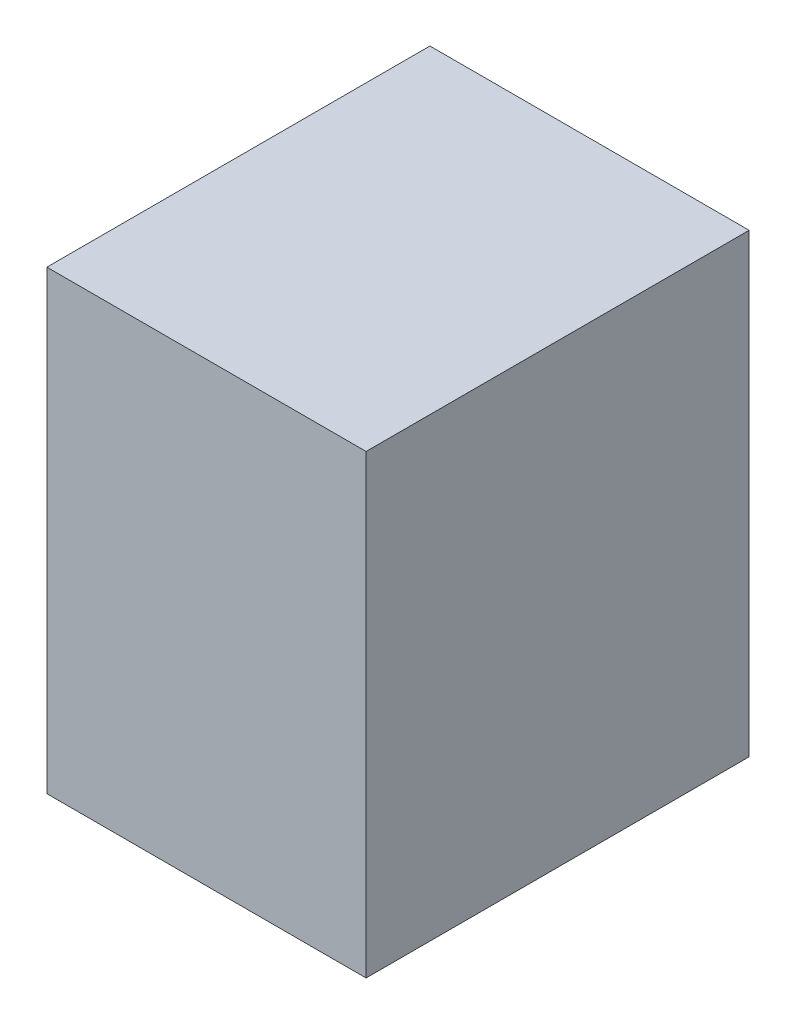
ISO-10303-21;
HEADER;
FILE_DESCRIPTION(('STEP AP214'),'2;1');
FILE_NAME('part.step','',(''),(''),'','','');
FILE_SCHEMA(('AUTOMOTIVE_DESIGN { 1 0 10303 214 1 1 1 1 }'));
ENDSEC;
DATA;
#1=APPLICATION_CONTEXT('core data for automotive mechanical design processes');
#2=APPLICATION_PROTOCOL_DEFINITION('international standard','automotive_design',2000,#1);
#3=PRODUCT_CONTEXT('',#1,'mechanical');
#4=PRODUCT('Part','Part','',(#3));
#5=PRODUCT_RELATED_PRODUCT_CATEGORY('part','',(#4));
#6=PRODUCT_DEFINITION_FORMATION('','',#4);
#7=PRODUCT_DEFINITION_CONTEXT('part definition',#1,'design');
#8=PRODUCT_DEFINITION('design','',#6,#7);
#9=PRODUCT_DEFINITION_SHAPE('','',#8);
#10=(LENGTH_UNIT() NAMED_UNIT(*) SI_UNIT(.MILLI.,.METRE.));
#11=(NAMED_UNIT(*) PLANE_ANGLE_UNIT() SI_UNIT($,.RADIAN.));
#12=(NAMED_UNIT(*) SI_UNIT($,.STERADIAN.) SOLID_ANGLE_UNIT());
#13=UNCERTAINTY_MEASURE_WITH_UNIT(LENGTH_MEASURE(1.E-05),#10,'distance_accuracy_value','');
#14=(GEOMETRIC_REPRESENTATION_CONTEXT(3) GLOBAL_UNCERTAINTY_ASSIGNED_CONTEXT((#13)) GLOBAL_UNIT_ASSIGNED_CONTEXT((#10,
#11,#12)) REPRESENTATION_CONTEXT('',''));
#15=CARTESIAN_POINT('',(0.,0.,0.));
#16=DIRECTION('',(0.,0.,1.));
#17=DIRECTION('',(1.,0.,0.));
#18=AXIS2_PLACEMENT_3D('',#15,#16,#17);
#19=CARTESIAN_POINT('',(8.75,25.,10.5));
#20=DIRECTION('',(-1.,0.,0.));
#21=DIRECTION('',(0.,0.,1.));
#22=AXIS2_PLACEMENT_3D('',#19,#20,#21);
#23=PLANE('',#22);
#24=DIRECTION('',(0.,0.,-1.));
#25=VECTOR('',#24,1.);
#26=CARTESIAN_POINT('',(8.75,0.,10.5));
#27=LINE('',#26,#25);
#28=CARTESIAN_POINT('',(8.75,0.,10.5));
#29=VERTEX_POINT('',#28);
#30=CARTESIAN_POINT('',(8.75,0.,-10.5));
#31=VERTEX_POINT('',#30);
#32=EDGE_CURVE('E98',#29,#31,#27,.T.);
#33=ORIENTED_EDGE('',*,*,#32,.T.);
#34=DIRECTION('',(0.,-1.,0.));
#35=VECTOR('',#34,1.);
#36=CARTESIAN_POINT('',(8.75,25.,-10.5));
#37=LINE('',#36,#35);
#38=CARTESIAN_POINT('',(8.75,25.,-10.5));
#39=VERTEX_POINT('',#38);
#40=EDGE_CURVE('E11',#39,#31,#37,.T.);
#41=ORIENTED_EDGE('',*,*,#40,.F.);
#42=DIRECTION('',(0.,0.,-1.));
#43=VECTOR('',#42,1.);
#44=CARTESIAN_POINT('',(8.75,25.,10.5));
#45=LINE('',#44,#43);
#46=CARTESIAN_POINT('',(8.75,25.,10.5));
#47=VERTEX_POINT('',#46);
#48=EDGE_CURVE('E86',#47,#39,#45,.T.);
#49=ORIENTED_EDGE('',*,*,#48,.F.);
#50=DIRECTION('',(0.,-1.,0.));
#51=VECTOR('',#50,1.);
#52=CARTESIAN_POINT('',(8.75,25.,10.5));
#53=LINE('',#52,#51);
#54=EDGE_CURVE('E94',#47,#29,#53,.T.);
#55=ORIENTED_EDGE('',*,*,#54,.T.);
#56=EDGE_LOOP('',(#33,#41,#49,#55));
#57=FACE_BOUND('',#56,.T.);
#58=ADVANCED_FACE('F35',(#57),#23,.F.);
#59=CARTESIAN_POINT('',(-8.75,25.,-10.5));
#60=DIRECTION('',(0.,0.,1.));
#61=DIRECTION('',(1.,0.,0.));
#62=AXIS2_PLACEMENT_3D('',#59,#60,#61);
#63=PLANE('',#62);
#64=DIRECTION('',(-1.,0.,0.));
#65=VECTOR('',#64,1.);
#66=CARTESIAN_POINT('',(-8.75,0.,-10.5));
#67=LINE('',#66,#65);
#68=CARTESIAN_POINT('',(-8.75,0.,-10.5));
#69=VERTEX_POINT('',#68);
#70=EDGE_CURVE('E90',#31,#69,#67,.T.);
#71=ORIENTED_EDGE('',*,*,#70,.T.);
#72=DIRECTION('',(0.,-1.,0.));
#73=VECTOR('',#72,1.);
#74=CARTESIAN_POINT('',(-8.75,25.,-10.5));
#75=LINE('',#74,#73);
#76=CARTESIAN_POINT('',(-8.75,25.,-10.5));
#77=VERTEX_POINT('',#76);
#78=EDGE_CURVE('E43',#77,#69,#75,.T.);
#79=ORIENTED_EDGE('',*,*,#78,.F.);
#80=DIRECTION('',(-1.,0.,0.));
#81=VECTOR('',#80,1.);
#82=CARTESIAN_POINT('',(-8.75,25.,-10.5));
#83=LINE('',#82,#81);
#84=EDGE_CURVE('E81',#39,#77,#83,.T.);
#85=ORIENTED_EDGE('',*,*,#84,.F.);
#86=ORIENTED_EDGE('',*,*,#40,.T.);
#87=EDGE_LOOP('',(#71,#79,#85,#86));
#88=FACE_BOUND('',#87,.T.);
#89=ADVANCED_FACE('F89',(#88),#63,.F.);
#90=CARTESIAN_POINT('',(-8.75,25.,10.5));
#91=DIRECTION('',(1.,0.,0.));
#92=DIRECTION('',(0.,0.,-1.));
#93=AXIS2_PLACEMENT_3D('',#90,#91,#92);
#94=PLANE('',#93);
#95=DIRECTION('',(0.,0.,1.));
#96=VECTOR('',#95,1.);
#97=CARTESIAN_POINT('',(-8.75,0.,10.5));
#98=LINE('',#97,#96);
#99=CARTESIAN_POINT('',(-8.75,0.,10.5));
#100=VERTEX_POINT('',#99);
#101=EDGE_CURVE('E68',#69,#100,#98,.T.);
#102=ORIENTED_EDGE('',*,*,#101,.T.);
#103=DIRECTION('',(0.,-1.,0.));
#104=VECTOR('',#103,1.);
#105=CARTESIAN_POINT('',(-8.75,25.,10.5));
#106=LINE('',#105,#104);
#107=CARTESIAN_POINT('',(-8.75,25.,10.5));
#108=VERTEX_POINT('',#107);
#109=EDGE_CURVE('E91',#108,#100,#106,.T.);
#110=ORIENTED_EDGE('',*,*,#109,.F.);
#111=DIRECTION('',(0.,0.,1.));
#112=VECTOR('',#111,1.);
#113=CARTESIAN_POINT('',(-8.75,25.,10.5));
#114=LINE('',#113,#112);
#115=EDGE_CURVE('E84',#77,#108,#114,.T.);
#116=ORIENTED_EDGE('',*,*,#115,.F.);
#117=ORIENTED_EDGE('',*,*,#78,.T.);
#118=EDGE_LOOP('',(#102,#110,#116,#117));
#119=FACE_BOUND('',#118,.T.);
#120=ADVANCED_FACE('F92',(#119),#94,.F.);
#121=CARTESIAN_POINT('',(-8.75,25.,10.5));
#122=DIRECTION('',(0.,0.,-1.));
#123=DIRECTION('',(-1.,0.,0.));
#124=AXIS2_PLACEMENT_3D('',#121,#122,#123);
#125=PLANE('',#124);
#126=DIRECTION('',(1.,0.,0.));
#127=VECTOR('',#126,1.);
#128=CARTESIAN_POINT('',(-8.75,0.,10.5));
#129=LINE('',#128,#127);
#130=EDGE_CURVE('E74',#100,#29,#129,.T.);
#131=ORIENTED_EDGE('',*,*,#130,.T.);
#132=ORIENTED_EDGE('',*,*,#54,.F.);
#133=DIRECTION('',(1.,0.,0.));
#134=VECTOR('',#133,1.);
#135=CARTESIAN_POINT('',(-8.75,25.,10.5));
#136=LINE('',#135,#134);
#137=EDGE_CURVE('E51',#108,#47,#136,.T.);
#138=ORIENTED_EDGE('',*,*,#137,.F.);
#139=ORIENTED_EDGE('',*,*,#109,.T.);
#140=EDGE_LOOP('',(#131,#132,#138,#139));
#141=FACE_BOUND('',#140,.T.);
#142=ADVANCED_FACE('F105',(#141),#125,.F.);
#143=CARTESIAN_POINT('',(0.,25.,0.));
#144=DIRECTION('',(0.,-1.,0.));
#145=DIRECTION('',(0.,0.,-1.));
#146=AXIS2_PLACEMENT_3D('',#143,#144,#145);
#147=PLANE('',#146);
#148=ORIENTED_EDGE('',*,*,#48,.T.);
#149=ORIENTED_EDGE('',*,*,#84,.T.);
#150=ORIENTED_EDGE('',*,*,#115,.T.);
#151=ORIENTED_EDGE('',*,*,#137,.T.);
#152=EDGE_LOOP('',(#148,#149,#150,#151));
#153=FACE_BOUND('',#152,.T.);
#154=ADVANCED_FACE('F82',(#153),#147,.F.);
#155=CARTESIAN_POINT('',(0.,0.,0.));
#156=DIRECTION('',(0.,-1.,0.));
#157=DIRECTION('',(0.,0.,-1.));
#158=AXIS2_PLACEMENT_3D('',#155,#156,#157);
#159=PLANE('',#158);
#160=ORIENTED_EDGE('',*,*,#32,.F.);
#161=ORIENTED_EDGE('',*,*,#130,.F.);
#162=ORIENTED_EDGE('',*,*,#101,.F.);
#163=ORIENTED_EDGE('',*,*,#70,.F.);
#164=EDGE_LOOP('',(#160,#161,#162,#163));
#165=FACE_BOUND('',#164,.T.);
#166=ADVANCED_FACE('F108',(#165),#159,.T.);
#167=CLOSED_SHELL('',(#58,#89,#120,#142,#154,#166));
#168=MANIFOLD_SOLID_BREP('B2',#167);
#169=ADVANCED_BREP_SHAPE_REPRESENTATION('',(#18,#168),#14);
#170=SHAPE_DEFINITION_REPRESENTATION(#9,#169);
ENDSEC;
END-ISO-10303-21;
